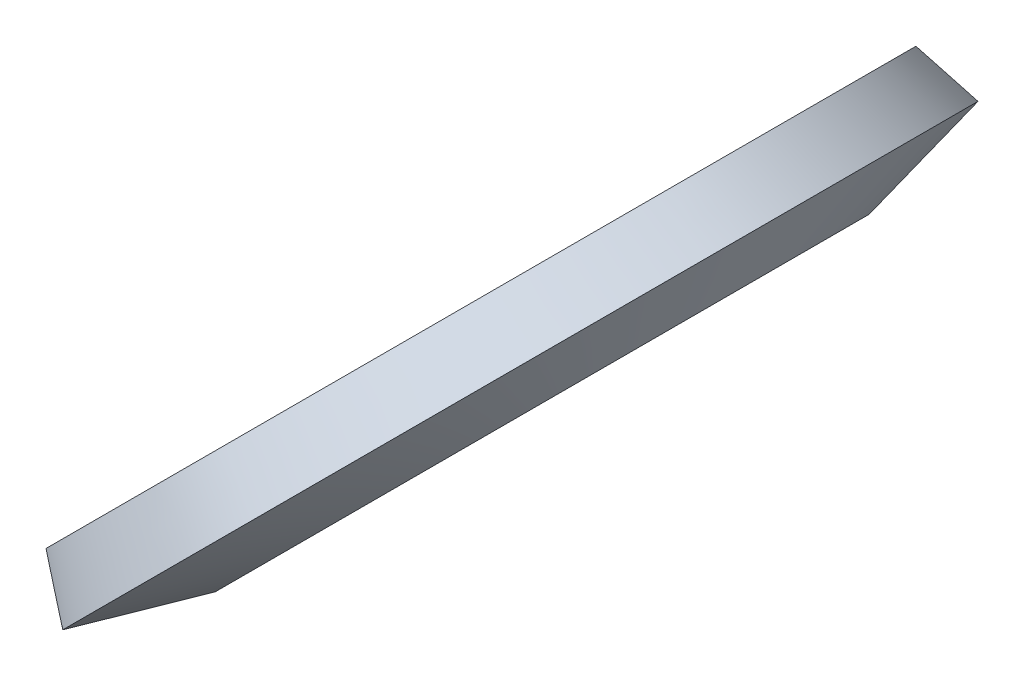
ISO-10303-21;
HEADER;
FILE_DESCRIPTION(('STEP AP214'),'2;1');
FILE_NAME('part.step','',(''),(''),'','','');
FILE_SCHEMA(('AUTOMOTIVE_DESIGN { 1 0 10303 214 1 1 1 1 }'));
ENDSEC;
DATA;
#1=APPLICATION_CONTEXT('core data for automotive mechanical design processes');
#2=APPLICATION_PROTOCOL_DEFINITION('international standard','automotive_design',2000,#1);
#3=PRODUCT_CONTEXT('',#1,'mechanical');
#4=PRODUCT('Part','Part','',(#3));
#5=PRODUCT_RELATED_PRODUCT_CATEGORY('part','',(#4));
#6=PRODUCT_DEFINITION_FORMATION('','',#4);
#7=PRODUCT_DEFINITION_CONTEXT('part definition',#1,'design');
#8=PRODUCT_DEFINITION('design','',#6,#7);
#9=PRODUCT_DEFINITION_SHAPE('','',#8);
#10=(LENGTH_UNIT() NAMED_UNIT(*) SI_UNIT(.MILLI.,.METRE.));
#11=(NAMED_UNIT(*) PLANE_ANGLE_UNIT() SI_UNIT($,.RADIAN.));
#12=(NAMED_UNIT(*) SI_UNIT($,.STERADIAN.) SOLID_ANGLE_UNIT());
#13=UNCERTAINTY_MEASURE_WITH_UNIT(LENGTH_MEASURE(1.E-05),#10,'distance_accuracy_value','');
#14=(GEOMETRIC_REPRESENTATION_CONTEXT(3) GLOBAL_UNCERTAINTY_ASSIGNED_CONTEXT((#13)) GLOBAL_UNIT_ASSIGNED_CONTEXT((#10,
#11,#12)) REPRESENTATION_CONTEXT('',''));
#15=CARTESIAN_POINT('',(0.,0.,0.));
#16=DIRECTION('',(0.,0.,1.));
#17=DIRECTION('',(1.,0.,0.));
#18=AXIS2_PLACEMENT_3D('',#15,#16,#17);
#19=CARTESIAN_POINT('',(9.30354534144064,-9.30354534144276,-47.6815));
#20=DIRECTION('',(-0.707106781186549,0.707106781186547,0.));
#21=DIRECTION('',(-0.707106781186547,-0.707106781186549,0.));
#22=AXIS2_PLACEMENT_3D('',#19,#20,#21);
#23=CONICAL_SURFACE('',#22,32.4888322096395,1.25115860945585);
#24=CARTESIAN_POINT('',(9.27532734281967,-9.27532734282178,-47.6815));
#25=DIRECTION('',(0.707106781186549,-0.707106781186547,0.));
#26=DIRECTION('',(0.707106781186547,0.707106781186549,0.));
#27=AXIS2_PLACEMENT_3D('',#24,#25,#26);
#28=CIRCLE('',#27,32.6093995729998);
#29=CARTESIAN_POINT('',(32.3336549113095,13.7830002256681,-47.6815));
#30=VERTEX_POINT('',#29);
#31=EDGE_CURVE('E53',#30,#30,#28,.F.);
#32=ORIENTED_EDGE('',*,*,#31,.T.);
#33=EDGE_LOOP('',(#32));
#34=FACE_BOUND('',#33,.T.);
#35=CARTESIAN_POINT('',(9.30354534144064,-9.30354534144276,-47.6815));
#36=DIRECTION('',(-0.707106781186549,0.707106781186547,0.));
#37=DIRECTION('',(-0.707106781186547,-0.707106781186549,0.));
#38=AXIS2_PLACEMENT_3D('',#35,#36,#37);
#39=CIRCLE('',#38,32.4888322096395);
#40=CARTESIAN_POINT('',(-13.6695282268274,-32.2766189097108,-47.6815));
#41=VERTEX_POINT('',#40);
#42=EDGE_CURVE('E56',#41,#41,#39,.T.);
#43=ORIENTED_EDGE('',*,*,#42,.F.);
#44=EDGE_LOOP('',(#43));
#45=FACE_BOUND('',#44,.T.);
#46=ADVANCED_FACE('F15',(#34,#45),#23,.F.);
#47=CARTESIAN_POINT('',(11.9527210513018,-11.9527210513039,-47.6815));
#48=DIRECTION('',(-0.707106781186549,0.707106781186547,0.));
#49=DIRECTION('',(-0.707106781186547,-0.707106781186549,0.));
#50=AXIS2_PLACEMENT_3D('',#47,#48,#49);
#51=CONICAL_SURFACE('',#50,23.2760744987763,1.25031206300701);
#52=CARTESIAN_POINT('',(11.9810112112742,-11.9810112112763,-47.6815));
#53=DIRECTION('',(0.707106781186549,-0.707106781186547,0.));
#54=DIRECTION('',(0.707106781186547,0.707106781186549,0.));
#55=AXIS2_PLACEMENT_3D('',#52,#53,#54);
#56=CIRCLE('',#55,23.1555409611302);
#57=CARTESIAN_POINT('',(28.3544512469323,4.39242882438176,-47.6815));
#58=VERTEX_POINT('',#57);
#59=EDGE_CURVE('E48',#58,#58,#56,.F.);
#60=ORIENTED_EDGE('',*,*,#59,.F.);
#61=EDGE_LOOP('',(#60));
#62=FACE_BOUND('',#61,.T.);
#63=CARTESIAN_POINT('',(11.9527210513018,-11.9527210513039,-47.6815));
#64=DIRECTION('',(-0.707106781186549,0.707106781186547,0.));
#65=DIRECTION('',(-0.707106781186547,-0.707106781186549,0.));
#66=AXIS2_PLACEMENT_3D('',#63,#64,#65);
#67=CIRCLE('',#66,23.2760744987763);
#68=CARTESIAN_POINT('',(-4.50594906618614,-28.411391168792,-47.6815));
#69=VERTEX_POINT('',#68);
#70=EDGE_CURVE('E34',#69,#69,#67,.T.);
#71=ORIENTED_EDGE('',*,*,#70,.T.);
#72=EDGE_LOOP('',(#71));
#73=FACE_BOUND('',#72,.T.);
#74=ADVANCED_FACE('F90',(#62,#73),#51,.F.);
#75=CARTESIAN_POINT('',(14.8013462689788,-14.8013462689809,-47.6815));
#76=DIRECTION('',(0.707106781186549,-0.707106781186547,0.));
#77=DIRECTION('',(0.707106781186547,0.707106781186549,0.));
#78=AXIS2_PLACEMENT_3D('',#75,#76,#77);
#79=CONICAL_SURFACE('',#78,24.4794501654306,0.320484263787889);
#80=ORIENTED_EDGE('',*,*,#59,.T.);
#81=EDGE_LOOP('',(#80));
#82=FACE_BOUND('',#81,.T.);
#83=CARTESIAN_POINT('',(32.2147574652405,2.44847205476165,-48.2773739556537));
#84=CARTESIAN_POINT('',(32.2029230886262,2.43663767814738,-48.9660076552401));
#85=CARTESIAN_POINT('',(32.1705536763777,2.40426826589886,-49.6538542120863));
#86=CARTESIAN_POINT('',(32.0649725007725,2.29868709029367,-51.0234760850385));
#87=CARTESIAN_POINT('',(31.9917499935742,2.22546458309536,-51.7052497561148));
#88=CARTESIAN_POINT('',(31.8048682745184,2.03858286403957,-53.0583947152509));
#89=CARTESIAN_POINT('',(31.6911643489558,1.92487893847699,-53.7297536405614));
#90=CARTESIAN_POINT('',(31.4241529971192,1.65786758664036,-55.0564860026139));
#91=CARTESIAN_POINT('',(31.2708482014105,1.50456279093171,-55.7118604979895));
#92=CARTESIAN_POINT('',(30.9258006679341,1.15951525745529,-57.0017094217907));
#93=CARTESIAN_POINT('',(30.7340753657144,0.967789955235613,-57.6361931790892));
#94=CARTESIAN_POINT('',(30.3135035684411,0.547218157962218,-58.8800707668851));
#95=CARTESIAN_POINT('',(30.0846564872383,0.318371076759427,-59.4894642010182));
#96=CARTESIAN_POINT('',(29.5915336216095,-0.174751788869351,-60.678664835056));
#97=CARTESIAN_POINT('',(29.327266881617,-0.439018528861878,-61.2584795358986));
#98=CARTESIAN_POINT('',(28.7651393020093,-1.0011461084695,-62.3845662293931));
#99=CARTESIAN_POINT('',(28.4672785938264,-1.29900681665237,-62.9308383532631));
#100=CARTESIAN_POINT('',(27.8400459562199,-1.92623945425895,-63.9860157280706));
#101=CARTESIAN_POINT('',(27.5106706812425,-2.25561472923638,-64.494917001599));
#102=CARTESIAN_POINT('',(26.8227768035597,-2.94350860691911,-65.471671249112));
#103=CARTESIAN_POINT('',(26.4642581713208,-3.30202723915809,-65.9395241814974));
#104=CARTESIAN_POINT('',(25.7206121235614,-4.0456732869175,-66.830872522353));
#105=CARTESIAN_POINT('',(25.3354836729142,-4.43080173756466,-67.2543662036262));
#106=CARTESIAN_POINT('',(24.5413686251991,-5.22491678527978,-68.0539642307673));
#107=CARTESIAN_POINT('',(24.1323820328021,-5.63390337767671,-68.4300685859132));
#108=CARTESIAN_POINT('',(23.2934661909901,-6.47281921948876,-69.1322075581434));
#109=CARTESIAN_POINT('',(22.8635373305969,-6.902748079882,-69.458243104835));
#110=CARTESIAN_POINT('',(21.9857864681109,-7.78049894236801,-70.0579349297685));
#111=CARTESIAN_POINT('',(21.5379644656882,-8.22832094479061,-70.3315912070448));
#112=CARTESIAN_POINT('',(20.6276120033529,-9.13867340712594,-70.8245784483427));
#113=CARTESIAN_POINT('',(20.1650815731977,-9.60120383728113,-71.0439095222652));
#114=CARTESIAN_POINT('',(19.2285997007983,-10.5376857096805,-71.4266877670392));
#115=CARTESIAN_POINT('',(18.7546482585672,-11.0116371519116,-71.5901349379551));
#116=CARTESIAN_POINT('',(17.7986929516727,-11.9675924588062,-71.859983625532));
#117=CARTESIAN_POINT('',(17.316689071627,-12.4495963388519,-71.9663850332079));
#118=CARTESIAN_POINT('',(16.348056537364,-13.4182288731149,-72.1213852664897));
#119=CARTESIAN_POINT('',(15.8614278831481,-13.9048575273308,-72.1699840921121));
#120=CARTESIAN_POINT('',(14.8870063247778,-14.8792790857011,-72.2090336171678));
#121=CARTESIAN_POINT('',(14.3992134227257,-15.3670719877532,-72.1994844215214));
#122=CARTESIAN_POINT('',(13.4259304024025,-16.3403550080763,-72.1223060382965));
#123=CARTESIAN_POINT('',(12.9404402841287,-16.8258451263502,-72.0546768507886));
#124=CARTESIAN_POINT('',(11.975214188025,-17.7910712224538,-71.8618192498777));
#125=CARTESIAN_POINT('',(11.4954782123459,-18.270807198133,-71.7365908149467));
#126=CARTESIAN_POINT('',(10.5451712175525,-19.2211141929264,-71.4294250102947));
#127=CARTESIAN_POINT('',(10.0746001984504,-19.6916852120285,-71.2474876404986));
#128=CARTESIAN_POINT('',(9.14596810070746,-20.6203173097714,-70.828197208621));
#129=CARTESIAN_POINT('',(8.68790703528488,-21.078378375194,-70.590844087989));
#130=CARTESIAN_POINT('',(7.78755190548236,-21.9787335049965,-70.0624096991254));
#131=CARTESIAN_POINT('',(7.34525784111051,-22.4210275693684,-69.7713284308664));
#132=CARTESIAN_POINT('',(6.47958130385099,-23.2867041066279,-69.1375072658387));
#133=CARTESIAN_POINT('',(6.05619882480022,-23.7100865856787,-68.7947673859053));
#134=CARTESIAN_POINT('',(5.23135530188844,-24.5349301085905,-68.0600656042169));
#135=CARTESIAN_POINT('',(4.82989425801139,-24.9363911524675,-67.668103702498));
#136=CARTESIAN_POINT('',(4.051747911582,-25.7145374988969,-66.8377446608894));
#137=CARTESIAN_POINT('',(3.67506259899396,-26.091222811485,-66.3993475398089));
#138=CARTESIAN_POINT('',(2.94914554309775,-26.8171398673812,-65.4792346684112));
#139=CARTESIAN_POINT('',(2.59991379978639,-27.1663716106925,-64.997518918099));
#140=CARTESIAN_POINT('',(1.93138666398153,-27.8348987464974,-63.9941934282846));
#141=CARTESIAN_POINT('',(1.61209127559586,-28.154194134883,-63.4725836833082));
#142=CARTESIAN_POINT('',(1.00570690231933,-28.7605785081596,-62.3931785942949));
#143=CARTESIAN_POINT('',(0.718617917436547,-29.0476674930424,-61.835383250249));
#144=CARTESIAN_POINT('',(0.178687346310818,-29.5875980641681,-60.6875724782232));
#145=CARTESIAN_POINT('',(-0.0741542354534744,-29.8404396459324,-60.0975570460298));
#146=CARTESIAN_POINT('',(-0.543792403641475,-30.3100778141204,-58.8895008211666));
#147=CARTESIAN_POINT('',(-0.760588990063917,-30.5268744005428,-58.2714600284957));
#148=CARTESIAN_POINT('',(-1.15659586503571,-30.9228812755146,-57.0117470100303));
#149=CARTESIAN_POINT('',(-1.33580615519643,-31.1020915656754,-56.3700747852489));
#150=CARTESIAN_POINT('',(-1.6553663715058,-31.4216517819847,-55.0676607828712));
#151=CARTESIAN_POINT('',(-1.79571629765749,-31.5620017081364,-54.4069190052764));
#152=CARTESIAN_POINT('',(-2.03655797660175,-31.8028433870807,-53.0710634057529));
#153=CARTESIAN_POINT('',(-2.13704973119108,-31.90333514167,-52.3959495844719));
#154=CARTESIAN_POINT('',(-2.29746063990684,-32.0637460503858,-51.0361495233053));
#155=CARTESIAN_POINT('',(-2.35737979403435,-32.1236652045133,-50.3514632834197));
#156=CARTESIAN_POINT('',(-2.43621951256109,-32.20250492304,-48.9773860937555));
#157=CARTESIAN_POINT('',(-2.45514007696031,-32.2214254874392,-48.2879951439767));
#158=CARTESIAN_POINT('',(-2.45184810216198,-32.2181335126409,-46.9094096909043));
#159=CARTESIAN_POINT('',(-2.42963556296333,-32.1959209734422,-46.2202151876107));
#160=CARTESIAN_POINT('',(-2.3442352968744,-32.1105207073533,-44.846922356305));
#161=CARTESIAN_POINT('',(-2.28104756813701,-32.0473329786159,-44.1628240285226));
#162=CARTESIAN_POINT('',(-2.11414614810939,-31.8804315585883,-42.8045871091045));
#163=CARTESIAN_POINT('',(-2.010432456816,-31.7767178672949,-42.1304485174696));
#164=CARTESIAN_POINT('',(-1.76321644861025,-31.5295018590892,-40.7969237634756));
#165=CARTESIAN_POINT('',(-1.61971412999211,-31.385999540471,-40.1375376017491));
#166=CARTESIAN_POINT('',(-1.29394108466351,-31.0602264951424,-38.8382055786143));
#167=CARTESIAN_POINT('',(-1.1116703579544,-30.8779557684333,-38.1982597172054));
#168=CARTESIAN_POINT('',(-0.709656358600851,-30.4759417690798,-36.9423580091493));
#169=CARTESIAN_POINT('',(-0.489913090856829,-30.2561985013358,-36.3264021593648));
#170=CARTESIAN_POINT('',(-0.0145162357424346,-29.7808016462213,-35.1228594626605));
#171=CARTESIAN_POINT('',(0.241137351618932,-29.52514805886,-34.5352726157335));
#172=CARTESIAN_POINT('',(0.786537264947313,-28.9797481455316,-33.3926453929662));
#173=CARTESIAN_POINT('',(1.07628358623616,-28.6900018242428,-32.8376050126599));
#174=CARTESIAN_POINT('',(1.68780907359707,-28.0784763368819,-31.7640166386498));
#175=CARTESIAN_POINT('',(2.00958823967287,-27.7566971708061,-31.2454686449502));
#176=CARTESIAN_POINT('',(2.68289189698623,-27.0833935134927,-30.248551406158));
#177=CARTESIAN_POINT('',(3.03441640027253,-26.7318690102064,-29.7701821773406));
#178=CARTESIAN_POINT('',(3.76471149019782,-26.0015739202811,-28.8570236227308));
#179=CARTESIAN_POINT('',(4.14348207685675,-25.6228033336221,-28.4222342969703));
#180=CARTESIAN_POINT('',(4.92557662788529,-24.8407087825936,-27.599326507444));
#181=CARTESIAN_POINT('',(5.32890060025662,-24.4373848102223,-27.2112080588878));
#182=CARTESIAN_POINT('',(6.15723441623828,-23.6090509942406,-26.4844014811386));
#183=CARTESIAN_POINT('',(6.58224425983748,-23.1840411506414,-26.1457133519202));
#184=CARTESIAN_POINT('',(7.45092779041829,-22.3153576200606,-25.5201756155875));
#185=CARTESIAN_POINT('',(7.89460145767971,-21.8716839527992,-25.2333259537025));
#186=CARTESIAN_POINT('',(8.79745880443724,-20.9688266060417,-24.7135040389413));
#187=CARTESIAN_POINT('',(9.25664248391283,-20.5096429265661,-24.4805317859939));
#188=CARTESIAN_POINT('',(10.1872551640514,-19.5790302464275,-24.0701210568959));
#189=CARTESIAN_POINT('',(10.6586841601375,-19.1076012503414,-23.8926825599893));
#190=CARTESIAN_POINT('',(11.6104360671496,-18.1558493433293,-23.5946007035583));
#191=CARTESIAN_POINT('',(12.0907589780864,-17.6755264323925,-23.4739573441028));
#192=CARTESIAN_POINT('',(13.056884784911,-16.7094006255679,-23.2903232976524));
#193=CARTESIAN_POINT('',(13.5426876906852,-16.2235977197937,-23.2273327146844));
#194=CARTESIAN_POINT('',(14.5163188608342,-15.2499665496446,-23.159452421439));
#195=CARTESIAN_POINT('',(15.0041471252097,-14.7621382852691,-23.1545627111782));
#196=CARTESIAN_POINT('',(15.9783599080995,-13.7879255023794,-23.2029188799176));
#197=CARTESIAN_POINT('',(16.4647444293701,-13.3015409811088,-23.2561646478514));
#198=CARTESIAN_POINT('',(17.4326127677963,-12.3336726426826,-23.4204130520501));
#199=CARTESIAN_POINT('',(17.9140965849463,-11.8521888255326,-23.5314156883817));
#200=CARTESIAN_POINT('',(18.8687414271957,-10.8975439832832,-23.8103889519313));
#201=CARTESIAN_POINT('',(19.3419024354559,-10.424382975023,-23.9783596943974));
#202=CARTESIAN_POINT('',(20.2765367502882,-9.48974866019072,-24.370074939388));
#203=CARTESIAN_POINT('',(20.7380100570756,-9.02827535340326,-24.5938194408843));
#204=CARTESIAN_POINT('',(21.6459966121558,-8.12028879832307,-25.0954961766395));
#205=CARTESIAN_POINT('',(22.0925095824933,-7.67377582798556,-25.3734294170432));
#206=CARTESIAN_POINT('',(22.9673919949796,-6.79889341549932,-25.9815050304892));
#207=CARTESIAN_POINT('',(23.3957614335761,-6.3705239769028,-26.311647413753));
#208=CARTESIAN_POINT('',(24.2312948397116,-5.53499057076731,-27.0217802238003));
#209=CARTESIAN_POINT('',(24.6384596319311,-5.12782577854779,-27.4017687099684));
#210=CARTESIAN_POINT('',(25.4287066992065,-4.3375787112724,-28.2089018955497));
#211=CARTESIAN_POINT('',(25.8117889986672,-3.95449641181161,-28.6360465471741));
#212=CARTESIAN_POINT('',(26.5511088247241,-3.21517658575475,-29.5344079695772));
#213=CARTESIAN_POINT('',(26.907349199673,-2.85893621080589,-30.0056200521774));
#214=CARTESIAN_POINT('',(27.590499509162,-2.17578590131682,-30.9888074107547));
#215=CARTESIAN_POINT('',(27.9174093289486,-1.84887608153023,-31.5007828462006));
#216=CARTESIAN_POINT('',(28.5396527900849,-1.22663262039397,-32.5619918827971));
#217=CARTESIAN_POINT('',(28.834978360446,-0.931307050032827,-33.1112349489311));
#218=CARTESIAN_POINT('',(29.3918531762157,-0.374432234263136,-34.2429476359093));
#219=CARTESIAN_POINT('',(29.6534029549188,-0.112882455560033,-34.8254167319297));
#220=CARTESIAN_POINT('',(30.1409823645498,0.374696954070969,-36.0197192419979));
#221=CARTESIAN_POINT('',(30.366995851537,0.600710441058109,-36.6315658382646));
#222=CARTESIAN_POINT('',(30.7817647565483,1.01547934606942,-37.8800618916857));
#223=CARTESIAN_POINT('',(30.9705176991071,1.20423228862829,-38.5167129934059));
#224=CARTESIAN_POINT('',(31.3092163344746,1.54293092399579,-39.8095460464604));
#225=CARTESIAN_POINT('',(31.4592047466562,1.69291933617731,-40.4657056018401));
#226=CARTESIAN_POINT('',(31.7195448283167,1.95325941783782,-41.7933369241264));
#227=CARTESIAN_POINT('',(31.8299069135479,2.06362150306905,-42.4648046178769));
#228=CARTESIAN_POINT('',(32.0327208400385,2.26643542955973,-43.9871142712427));
#229=CARTESIAN_POINT('',(32.1138810531157,2.3475956426369,-44.8410112567757));
#230=CARTESIAN_POINT('',(32.2122890744332,2.44600366395438,-46.5561393660481));
#231=CARTESIAN_POINT('',(32.2295368826735,2.46325147219468,-47.4173704897876));
#232=CARTESIAN_POINT('',(32.2147574652405,2.44847205476165,-48.2773739556537));
#233=B_SPLINE_CURVE_WITH_KNOTS('',3,(#83,#84,#85,#86,#87,#88,#89,#90,#91,#92,#93,#94,#95,#96,
#97,#98,#99,#100,#101,#102,#103,#104,#105,#106,#107,#108,#109,#110,#111,#112,#113,#114,#115,
#116,#117,#118,#119,#120,#121,#122,#123,#124,#125,#126,#127,#128,#129,#130,#131,#132,#133,#134,
#135,#136,#137,#138,#139,#140,#141,#142,#143,#144,#145,#146,#147,#148,#149,#150,#151,#152,#153,
#154,#155,#156,#157,#158,#159,#160,#161,#162,#163,#164,#165,#166,#167,#168,#169,#170,#171,#172,
#173,#174,#175,#176,#177,#178,#179,#180,#181,#182,#183,#184,#185,#186,#187,#188,#189,#190,#191,
#192,#193,#194,#195,#196,#197,#198,#199,#200,#201,#202,#203,#204,#205,#206,#207,#208,#209,#210,
#211,#212,#213,#214,#215,#216,#217,#218,#219,#220,#221,#222,#223,#224,#225,#226,#227,#228,#229,
#230,#231,#232),.UNSPECIFIED.,.T.,.F.,(4,2,2,2,2,2,2,2,2,2,2,2,2,2,2,2,2,2,2,2,2,2,2,2,2,2,2,2,
2,2,2,2,2,2,2,2,2,2,2,2,2,2,2,2,2,2,2,2,2,2,2,2,2,2,2,2,2,2,2,2,2,2,2,2,2,2,2,2,2,2,2,2,2,2,4),
(0.,2.06575970447976,4.13206293359958,6.20065561279211,8.26911091698306,10.3366296559171,
12.404181043938,14.4712054836141,16.5382218365949,18.6054578658699,20.6726959900941,
22.7400145755785,24.8073327563181,26.8746125493549,28.9418923804979,31.0091680294628,
33.0764436760443,35.1437232721089,37.2110028675821,39.2782787329303,41.3455545957704,
43.4128312312695,45.4801078695046,47.5473866919706,49.6146655154965,51.6819436653124,
53.7492218136166,55.8164991245398,57.8837764352227,59.9510540295749,62.0183316244454,
64.0856094896609,66.1528873549489,68.2201651316106,70.2874429081108,72.3547205914206,
74.421998274675,76.4892759579293,78.5565536412391,80.6238314177394,82.691109194401,
84.758387059689,86.8256649249044,88.892942519775,90.9602201141271,93.0274974248099,
95.0947747357332,97.1620528840373,99.2293310338532,101.296609857379,103.363888679845,
105.43116531808,107.498441953579,109.565717816419,111.632993681767,113.700273277241,
115.767552873305,117.834828519887,119.902104168852,121.969383999995,124.036663793031,
126.103981973771,128.171300559255,130.238538683479,132.305774712754,134.372791065735,
136.439815505411,138.507366893432,140.574885632366,142.643340936557,144.71193361575,
146.778236844869,148.843996549349,151.42383036603,154.003664182711),.UNSPECIFIED.);
#234=CARTESIAN_POINT('',(32.2147574652405,2.44847205476165,-48.2773739556537));
#235=VERTEX_POINT('',#234);
#236=EDGE_CURVE('E59',#235,#235,#233,.T.);
#237=ORIENTED_EDGE('',*,*,#236,.F.);
#238=EDGE_LOOP('',(#237));
#239=FACE_BOUND('',#238,.T.);
#240=ADVANCED_FACE('F86',(#82,#239),#79,.F.);
#241=CARTESIAN_POINT('',(9.27532734281967,-9.27532734282178,-47.6815));
#242=DIRECTION('',(0.707106781186549,-0.707106781186547,0.));
#243=DIRECTION('',(0.707106781186547,0.707106781186549,0.));
#244=AXIS2_PLACEMENT_3D('',#241,#242,#243);
#245=CONICAL_SURFACE('',#244,32.6093995729998,0.319637717339043);
#246=CARTESIAN_POINT('',(37.1409642380814,11.3558699832728,-48.5151793219077));
#247=CARTESIAN_POINT('',(37.1265445973949,11.3414503425863,-49.3539315689927));
#248=CARTESIAN_POINT('',(37.0903561434953,11.3052618886868,-50.1919779253497));
#249=CARTESIAN_POINT('',(36.9746286136576,11.1895343588491,-51.8620825289094));
#250=CARTESIAN_POINT('',(36.8950875793754,11.1099933245669,-52.6941405038815));
#251=CARTESIAN_POINT('',(36.6930207678407,10.9079265130322,-54.3483128894096));
#252=CARTESIAN_POINT('',(36.5704662490176,10.7853719942091,-55.1704202700695));
#253=CARTESIAN_POINT('',(36.2830162262268,10.4979219714183,-56.7997951643614));
#254=CARTESIAN_POINT('',(36.1181192444134,10.3330249896048,-57.6070621589769));
#255=CARTESIAN_POINT('',(35.8259559031771,10.0408616483686,-58.8625831675134));
#256=CARTESIAN_POINT('',(35.7125516592331,9.92745740442454,-59.3173796496774));
#257=CARTESIAN_POINT('',(35.47231744619,9.68722319138146,-60.219714559994));
#258=CARTESIAN_POINT('',(35.3454900900567,9.56039583524819,-60.6672543812514));
#259=CARTESIAN_POINT('',(34.9451146043048,9.16002034949625,-61.9980714800357));
#260=CARTESIAN_POINT('',(34.6516675559885,8.86657330117995,-62.8695700242447));
#261=CARTESIAN_POINT('',(34.0138708931696,8.22877663836104,-64.5745919781373));
#262=CARTESIAN_POINT('',(33.6695095986614,7.88441534385288,-65.408106616555));
#263=CARTESIAN_POINT('',(32.9323523911917,7.1472581363832,-67.0311511121955));
#264=CARTESIAN_POINT('',(32.5395576819772,6.75446342716866,-67.8206820618656));
#265=CARTESIAN_POINT('',(31.7083700598794,5.92327580507091,-69.3500543529127));
#266=CARTESIAN_POINT('',(31.2699814488692,5.48488719406068,-70.0899003713387));
#267=CARTESIAN_POINT('',(30.3506866508756,4.56559239606705,-71.5147392864663));
#268=CARTESIAN_POINT('',(29.8697802127903,4.08468595798181,-72.1997318591689));
#269=CARTESIAN_POINT('',(28.8689028698958,3.08380861508729,-73.5099453952777));
#270=CARTESIAN_POINT('',(28.3489343781491,2.56384012334052,-74.1351700454401));
#271=CARTESIAN_POINT('',(27.2736038341572,1.48850957934862,-75.3214508354055));
#272=CARTESIAN_POINT('',(26.7182418319873,0.933147577178778,-75.8825070659919));
#273=CARTESIAN_POINT('',(25.5760575268579,-0.209036727950622,-76.9364763764581));
#274=CARTESIAN_POINT('',(24.9892344433341,-0.795859811474417,-77.4293877645455));
#275=CARTESIAN_POINT('',(23.7883122994825,-1.99678195532611,-78.3435468572344));
#276=CARTESIAN_POINT('',(23.1742132298068,-2.61088102500173,-78.7647945372759));
#277=CARTESIAN_POINT('',(21.9230983847235,-3.86199587008505,-79.5326353492035));
#278=CARTESIAN_POINT('',(21.2860823625521,-4.49901189225651,-79.8792276769392));
#279=CARTESIAN_POINT('',(19.9936687573321,-5.79142549747647,-80.4952879268485));
#280=CARTESIAN_POINT('',(19.3382711754615,-6.44682307934706,-80.7647558539642));
#281=CARTESIAN_POINT('',(18.0137571290566,-7.77133712575195,-81.2246504517471));
#282=CARTESIAN_POINT('',(17.3446407304238,-8.44045352438477,-81.4150775020118));
#283=CARTESIAN_POINT('',(15.9974430167252,-9.78765123808334,-81.7155383883217));
#284=CARTESIAN_POINT('',(15.3193617016077,-10.4657325532009,-81.825572223902));
#285=CARTESIAN_POINT('',(13.9590557683274,-11.8260384864812,-81.9644643162246));
#286=CARTESIAN_POINT('',(13.2768311553418,-12.5082630994668,-81.9933226743756));
#287=CARTESIAN_POINT('',(11.9130879884234,-13.8720062663852,-81.9696589364741));
#288=CARTESIAN_POINT('',(11.2315694344902,-14.5535248203184,-81.9171368404699));
#289=CARTESIAN_POINT('',(9.8740830925023,-15.9110111623063,-81.7310855291356));
#290=CARTESIAN_POINT('',(9.19811530833315,-16.5869789464754,-81.5975562571059));
#291=CARTESIAN_POINT('',(7.85653671571245,-17.9285575390961,-81.2504398586621));
#292=CARTESIAN_POINT('',(7.19092590726362,-18.594168347545,-81.0368527322269));
#293=CARTESIAN_POINT('',(5.87479346167718,-19.9103007931314,-80.5311391404419));
#294=CARTESIAN_POINT('',(5.22427182223177,-20.5608224325768,-80.2390126871044));
#295=CARTESIAN_POINT('',(3.94294242776534,-21.8421518270433,-79.5782972706172));
#296=CARTESIAN_POINT('',(3.31213467274195,-22.4729595820666,-79.2097083074767));
#297=CARTESIAN_POINT('',(2.07471771581806,-23.7103765389905,-78.3986883204402));
#298=CARTESIAN_POINT('',(1.46810851375141,-24.3169857410572,-77.9562572970512));
#299=CARTESIAN_POINT('',(0.283401285376274,-25.5016929694324,-77.0006986066982));
#300=CARTESIAN_POINT('',(-0.294696740929125,-26.0797909957378,-76.4875709397266));
#301=CARTESIAN_POINT('',(-1.41827178143872,-27.2033660362474,-75.3942669007641));
#302=CARTESIAN_POINT('',(-1.9637487902114,-27.74884304502,-74.8140905176095));
#303=CARTESIAN_POINT('',(-3.01820367583335,-28.803297930642,-73.5908138221522));
#304=CARTESIAN_POINT('',(-3.5271815526784,-29.312275807487,-72.9477135098422));
#305=CARTESIAN_POINT('',(-4.50501962294772,-30.2901138777563,-71.603161046558));
#306=CARTESIAN_POINT('',(-4.9738798182654,-30.758974073074,-70.9017088983378));
#307=CARTESIAN_POINT('',(-5.86814923700071,-31.6532434918094,-69.4454396419202));
#308=CARTESIAN_POINT('',(-6.29355846042389,-32.0786527152325,-68.6906225337297));
#309=CARTESIAN_POINT('',(-7.09790150147295,-32.8829957562816,-67.1329897113406));
#310=CARTESIAN_POINT('',(-7.47683532245141,-33.26192957726,-66.3301740006045));
#311=CARTESIAN_POINT('',(-8.18553360212502,-33.9706278569337,-64.6822514621138));
#312=CARTESIAN_POINT('',(-8.51529806082115,-34.3003923156298,-63.83714463436));
#313=CARTESIAN_POINT('',(-9.12331319634807,-34.9084074511567,-62.1106480419508));
#314=CARTESIAN_POINT('',(-9.40156387182861,-35.1866581266373,-61.2292582763444));
#315=CARTESIAN_POINT('',(-9.90457323470468,-35.6896674895133,-59.4364619819751));
#316=CARTESIAN_POINT('',(-10.1293319220978,-35.9144261769064,-58.5250554532108));
#317=CARTESIAN_POINT('',(-10.5237594131083,-36.3088536679169,-56.6787051685401));
#318=CARTESIAN_POINT('',(-10.6934282156381,-36.4785224704467,-55.743761412169));
#319=CARTESIAN_POINT('',(-10.9764696872916,-36.7615639421002,-53.8569835796799));
#320=CARTESIAN_POINT('',(-11.0898423564155,-36.8749366112241,-52.9051495035619));
#321=CARTESIAN_POINT('',(-11.2594855480596,-37.0445798028682,-50.991358017888));
#322=CARTESIAN_POINT('',(-11.3157560715446,-37.1008503263533,-50.0294006085031));
#323=CARTESIAN_POINT('',(-11.3707949255749,-37.1558891803835,-48.1022013812012));
#324=CARTESIAN_POINT('',(-11.3695632561207,-37.1546575109293,-47.1369595632842));
#325=CARTESIAN_POINT('',(-11.3096064802821,-37.0947007350907,-45.2100537962817));
#326=CARTESIAN_POINT('',(-11.2508813730907,-37.0359756278994,-44.2483898472464));
#327=CARTESIAN_POINT('',(-11.0763552209152,-36.8614494757239,-42.3354766862125));
#328=CARTESIAN_POINT('',(-10.9605541759285,-36.7456484307372,-41.3842274742143));
#329=CARTESIAN_POINT('',(-10.6726994198593,-36.457793674668,-39.4989065707911));
#330=CARTESIAN_POINT('',(-10.500645707074,-36.2857399618827,-38.5648348798861));
#331=CARTESIAN_POINT('',(-10.1015088152604,-35.8866030700691,-36.7205097388255));
#332=CARTESIAN_POINT('',(-9.87442563623283,-35.6595198910415,-35.8102562886696));
#333=CARTESIAN_POINT('',(-9.3668442563502,-35.1519385111589,-34.0200390530325));
#334=CARTESIAN_POINT('',(-9.08634605947656,-34.8714403142852,-33.1400752652936));
#335=CARTESIAN_POINT('',(-8.47392880693943,-34.2590230617481,-31.416693298121));
#336=CARTESIAN_POINT('',(-8.14200975128356,-33.9271040060923,-30.5732751186818));
#337=CARTESIAN_POINT('',(-7.42911055601143,-33.2142048108201,-28.9289806333051));
#338=CARTESIAN_POINT('',(-7.04813042043893,-32.8332246752476,-28.1281043238611));
#339=CARTESIAN_POINT('',(-6.2398175838785,-32.0249118386872,-26.574587252961));
#340=CARTESIAN_POINT('',(-5.81248488288747,-31.5975791376961,-25.8219464915082));
#341=CARTESIAN_POINT('',(-4.91450488665982,-30.6995991414685,-24.3702511663641));
#342=CARTESIAN_POINT('',(-4.44385758105829,-30.2289518358669,-23.6711966154957));
#343=CARTESIAN_POINT('',(-3.46259448341542,-29.2476887382241,-22.3316437710457));
#344=CARTESIAN_POINT('',(-2.95197869135672,-28.7370729461654,-21.6911454774894));
#345=CARTESIAN_POINT('',(-1.89440869251084,-27.6795029473195,-20.4732585910979));
#346=CARTESIAN_POINT('',(-1.34745447874508,-27.1325487335537,-19.8958700103826));
#347=CARTESIAN_POINT('',(-0.221096243429823,-26.0061904982385,-18.8083075805606));
#348=CARTESIAN_POINT('',(0.358307778109554,-25.4267864766991,-18.2981337314328));
#349=CARTESIAN_POINT('',(1.54544604070328,-24.2396482141054,-17.3486280933868));
#350=CARTESIAN_POINT('',(2.15318026410127,-23.6319139907074,-16.909296260318));
#351=CARTESIAN_POINT('',(3.39265864151995,-22.3924356132887,-16.1045976542258));
#352=CARTESIAN_POINT('',(4.02440279552256,-21.7606914592861,-15.7392308811467));
#353=CARTESIAN_POINT('',(5.30740957764866,-20.47768467716,-15.0850600019094));
#354=CARTESIAN_POINT('',(5.95867220160174,-19.8264220532069,-14.7962558793925));
#355=CARTESIAN_POINT('',(7.27608597057161,-18.509008284237,-14.2972634205112));
#356=CARTESIAN_POINT('',(7.9422371155982,-17.8428571392104,-14.0870750841986));
#357=CARTESIAN_POINT('',(9.28469270183943,-16.5004015529692,-13.746808330728));
#358=CARTESIAN_POINT('',(9.96099715372164,-15.824097101087,-13.6167299977436));
#359=CARTESIAN_POINT('',(11.3189505447639,-14.4661437100447,-13.4376083783696));
#360=CARTESIAN_POINT('',(12.0005994839254,-13.7844947708832,-13.3885650920004));
#361=CARTESIAN_POINT('',(13.3643949311704,-12.4206993236382,-13.371862244258));
#362=CARTESIAN_POINT('',(14.0465414386716,-11.738552816137,-13.4042025877807));
#363=CARTESIAN_POINT('',(15.4064831724681,-10.3786110823405,-13.5500368793994));
#364=CARTESIAN_POINT('',(16.084278398761,-9.7008158560476,-13.663530827541));
#365=CARTESIAN_POINT('',(17.4306997282975,-8.35439452651108,-13.9708656546134));
#366=CARTESIAN_POINT('',(18.0993258197054,-7.68576843510325,-14.1647066372484));
#367=CARTESIAN_POINT('',(19.4226544390085,-6.36243981580012,-14.6313574433547));
#368=CARTESIAN_POINT('',(20.0773569670654,-5.7077372877432,-14.9041672659093));
#369=CARTESIAN_POINT('',(21.3681911217326,-4.41690313307598,-15.5268197107634));
#370=CARTESIAN_POINT('',(22.0043225412405,-3.78077171356812,-15.8766631917603));
#371=CARTESIAN_POINT('',(23.2534843232795,-2.53160993152909,-16.6508940145939));
#372=CARTESIAN_POINT('',(23.866514682937,-1.91857957187162,-17.0752813657036));
#373=CARTESIAN_POINT('',(25.0651018208193,-0.719992433989252,-17.9955718870394));
#374=CARTESIAN_POINT('',(25.6506592424052,-0.134435012403414,-18.491473381439));
#375=CARTESIAN_POINT('',(26.7901526226226,1.00505836781406,-19.5512738172796));
#376=CARTESIAN_POINT('',(27.3440886018356,1.55899434702705,-20.1151727144625));
#377=CARTESIAN_POINT('',(28.4163673119988,2.63127305719025,-21.3069213730551));
#378=CARTESIAN_POINT('',(28.9347123044684,3.14961804965983,-21.9347670648559));
#379=CARTESIAN_POINT('',(29.9321644095903,4.14707015478172,-23.2499778591457));
#380=CARTESIAN_POINT('',(30.4112714215792,4.62617716677062,-23.9373431143203));
#381=CARTESIAN_POINT('',(31.326910498792,5.54181624398344,-25.3668149714401));
#382=CARTESIAN_POINT('',(31.7634360410442,5.97834178623561,-26.1089299298993));
#383=CARTESIAN_POINT('',(32.5907207709499,6.80562651614134,-27.642523947009));
#384=CARTESIAN_POINT('',(32.9814804382098,7.19638618340127,-28.4340024882176));
#385=CARTESIAN_POINT('',(33.7145585310409,7.9294642762324,-30.0609198693284));
#386=CARTESIAN_POINT('',(34.0568639327558,8.27176967794727,-30.8963704458578));
#387=CARTESIAN_POINT('',(34.690488456979,8.90539420217043,-32.6051371890747));
#388=CARTESIAN_POINT('',(34.9818053252452,9.19671107043668,-33.4784550277741));
#389=CARTESIAN_POINT('',(35.511186047287,9.72609179247844,-35.2561050114627));
#390=CARTESIAN_POINT('',(35.7492845639273,9.96419030911875,-36.1604165238945));
#391=CARTESIAN_POINT('',(36.1707513450351,10.3856570902266,-37.9940884547783));
#392=CARTESIAN_POINT('',(36.3541292285863,10.5690349737777,-38.9234444394265));
#393=CARTESIAN_POINT('',(36.6266877749008,10.8415935200922,-40.5697918320127));
#394=CARTESIAN_POINT('',(36.7279427537992,10.9428484989906,-41.2828390968715));
#395=CARTESIAN_POINT('',(36.8982372163005,11.113142961492,-42.7167556487425));
#396=CARTESIAN_POINT('',(36.9672708460266,11.182176591218,-43.4376263327665));
#397=CARTESIAN_POINT('',(37.0727879281818,11.2876936733733,-44.8838722408727));
#398=CARTESIAN_POINT('',(37.109282050816,11.3241877960075,-45.609245909732));
#399=CARTESIAN_POINT('',(37.1496119168918,11.3645176620833,-47.0616495922097));
#400=CARTESIAN_POINT('',(37.1534540644729,11.3683598096643,-47.7886792530511));
#401=CARTESIAN_POINT('',(37.1409642380814,11.3558699832728,-48.5151793219077));
#402=B_SPLINE_CURVE_WITH_KNOTS('',3,(#246,#247,#248,#249,#250,#251,#252,#253,#254,#255,#256,
#257,#258,#259,#260,#261,#262,#263,#264,#265,#266,#267,#268,#269,#270,#271,#272,#273,#274,#275,
#276,#277,#278,#279,#280,#281,#282,#283,#284,#285,#286,#287,#288,#289,#290,#291,#292,#293,#294,
#295,#296,#297,#298,#299,#300,#301,#302,#303,#304,#305,#306,#307,#308,#309,#310,#311,#312,#313,
#314,#315,#316,#317,#318,#319,#320,#321,#322,#323,#324,#325,#326,#327,#328,#329,#330,#331,#332,
#333,#334,#335,#336,#337,#338,#339,#340,#341,#342,#343,#344,#345,#346,#347,#348,#349,#350,#351,
#352,#353,#354,#355,#356,#357,#358,#359,#360,#361,#362,#363,#364,#365,#366,#367,#368,#369,#370,
#371,#372,#373,#374,#375,#376,#377,#378,#379,#380,#381,#382,#383,#384,#385,#386,#387,#388,#389,
#390,#391,#392,#393,#394,#395,#396,#397,#398,#399,#400,#401),.UNSPECIFIED.,.T.,.F.,(4,2,2,2,2,2,
2,2,2,2,2,2,2,2,2,2,2,2,2,2,2,2,2,2,2,2,2,2,2,2,2,2,2,2,2,2,2,2,2,2,2,2,2,2,2,2,2,2,2,2,2,2,2,2,
2,2,2,2,2,2,2,2,2,2,2,2,2,2,2,2,2,2,2,2,2,2,2,4),(0.,2.51651185884528,5.03313740422601,
7.55144776807376,10.069846038489,11.5161925645093,12.9622580583068,15.8543146467784,
18.7470357211723,21.6396849153838,24.5320614297134,27.4244550269849,30.3166700930309,
33.2088810672169,36.1011638317562,38.993447587515,41.885762495958,44.7780772190588,
47.6703780515192,50.5626789007018,53.4549761366605,56.347273370901,59.2395726295557,
62.1318718889739,65.0241707060314,67.9164695227433,70.8087683195962,73.7010671167626,
76.5933663955064,79.4856656745855,82.3779648171584,85.2702639593612,88.1625628929229,
91.0548618264276,93.9471608357444,96.839459845193,99.7317589117394,102.62405797827,
105.516356995926,108.408656013548,111.300955071766,114.193254130112,117.085553276,
119.977852421849,122.870151352116,125.762450281954,128.6547489734,131.547047665039,
134.439347048789,137.331646433796,140.223946374255,143.116246313812,146.008544450813,
148.900842585638,151.793140102486,154.685437621238,157.577738178993,160.47003873748,
163.362335916058,166.25463309626,169.146934009577,172.039234889323,174.931568011298,
177.823901493069,180.716167208367,183.608431041163,186.500510923584,189.392598225283,
192.285127866695,195.177627192948,198.07090251389,200.964305716454,203.855818822619,
206.746823343416,208.927291549641,211.108155742665,213.288304533482,215.468025714657),.UNSPECIFIED.);
#403=CARTESIAN_POINT('',(37.1409642380814,11.3558699832728,-48.5151793219077));
#404=VERTEX_POINT('',#403);
#405=EDGE_CURVE('E62',#404,#404,#402,.T.);
#406=ORIENTED_EDGE('',*,*,#405,.T.);
#407=EDGE_LOOP('',(#406));
#408=FACE_BOUND('',#407,.T.);
#409=ORIENTED_EDGE('',*,*,#31,.F.);
#410=EDGE_LOOP('',(#409));
#411=FACE_BOUND('',#410,.T.);
#412=ADVANCED_FACE('F76',(#408,#411),#245,.T.);
#413=CARTESIAN_POINT('',(-11.4172444254898,-37.029782203779,-46.8486768852573));
#414=CARTESIAN_POINT('',(-11.3787330069753,-37.0085311336075,-46.8497042270634));
#415=CARTESIAN_POINT('',(-11.3402215884609,-36.9872800634359,-46.8507315688694));
#416=CARTESIAN_POINT('',(-11.263296077294,-36.94483162869,-46.8527836561884));
#417=CARTESIAN_POINT('',(-11.224881982554,-36.9236343049691,-46.8538084010349));
#418=CARTESIAN_POINT('',(-9.77503386055476,-36.1235934800139,-46.8924849191107));
#419=CARTESIAN_POINT('',(-6.95308106110666,-34.5643225135041,-46.9677999631355));
#420=CARTESIAN_POINT('',(-4.13253584441346,-33.0026198794178,-47.043132614954));
#421=CARTESIAN_POINT('',(-2.68719690906945,-32.2018356162066,-47.081744401641));
#422=CARTESIAN_POINT('',(-2.65190901746933,-32.1822844885,-47.0826871070621));
#423=CARTESIAN_POINT('',(-2.58109295627999,-32.1430490838402,-47.0845789372728));
#424=CARTESIAN_POINT('',(-2.54556477570573,-32.1233648128111,-47.0855280621495));
#425=CARTESIAN_POINT('',(-2.51003659513146,-32.1036805417821,-47.0864771870262));
#426=B_SPLINE_CURVE_WITH_KNOTS('',3,(#413,#414,#415,#416,#417,#418,#419,#420,#421,#422,#423,
#424,#425),.UNSPECIFIED.,.F.,.F.,(4,2,2,1,2,2,4),(-0.000132016556134105,0.,0.000131682924561037,
0.00497005690673505,0.00980843088890907,0.00992951591836383,0.0100514255008133),.UNSPECIFIED.);
#427=CARTESIAN_POINT('',(11.9527210512905,-11.9527210512926,-47.6815));
#428=DIRECTION('',(-0.707106781186549,0.707106781186547,0.));
#429=AXIS1_PLACEMENT('',#427,#428);
#430=SURFACE_OF_REVOLUTION('',#426,#429);
#431=OFFSET_SURFACE('',#430,-0.127,.F.);
#432=ORIENTED_EDGE('',*,*,#236,.T.);
#433=EDGE_LOOP('',(#432));
#434=FACE_BOUND('',#433,.T.);
#435=ORIENTED_EDGE('',*,*,#405,.F.);
#436=EDGE_LOOP('',(#435));
#437=FACE_BOUND('',#436,.T.);
#438=ADVANCED_FACE('F79',(#434,#437),#431,.F.);
#439=CARTESIAN_POINT('',(11.9527210513018,-11.9527210513039,-47.6815));
#440=DIRECTION('',(0.707106781186549,-0.707106781186547,0.));
#441=DIRECTION('',(0.707106781186547,0.707106781186549,0.));
#442=AXIS2_PLACEMENT_3D('',#439,#440,#441);
#443=CONICAL_SURFACE('',#442,23.2760744987763,0.0208143970359136);
#444=CARTESIAN_POINT('',(9.30354534142583,-9.30354534142795,-47.6815));
#445=DIRECTION('',(-0.707106781186549,0.707106781186547,0.));
#446=DIRECTION('',(-0.707106781186547,-0.707106781186549,0.));
#447=AXIS2_PLACEMENT_3D('',#444,#445,#446);
#448=CIRCLE('',#447,23.1980820922975);
#449=CARTESIAN_POINT('',(-7.0999758165599,-25.7070664994137,-47.6815));
#450=VERTEX_POINT('',#449);
#451=EDGE_CURVE('E10',#450,#450,#448,.F.);
#452=ORIENTED_EDGE('',*,*,#451,.T.);
#453=EDGE_LOOP('',(#452));
#454=FACE_BOUND('',#453,.T.);
#455=CARTESIAN_POINT('',(9.303522581091,-9.30352258109312,-47.6815));
#456=DIRECTION('',(-0.707106781186549,0.707106781186547,0.));
#457=DIRECTION('',(-0.707106781186547,-0.707106781186549,0.));
#458=AXIS2_PLACEMENT_3D('',#455,#456,#457);
#459=CIRCLE('',#458,23.1980814222274);
#460=CARTESIAN_POINT('',(-7.09999810308365,-25.7070432652678,-47.6815));
#461=VERTEX_POINT('',#460);
#462=EDGE_CURVE('E43',#461,#461,#459,.T.);
#463=ORIENTED_EDGE('',*,*,#462,.T.);
#464=EDGE_LOOP('',(#463));
#465=FACE_BOUND('',#464,.T.);
#466=ADVANCED_FACE('F83',(#454,#465),#443,.F.);
#467=CARTESIAN_POINT('',(9.30354534144064,-9.30354534144276,-47.6815));
#468=DIRECTION('',(0.707106781186549,-0.707106781186547,0.));
#469=DIRECTION('',(0.707106781186547,0.707106781186549,0.));
#470=AXIS2_PLACEMENT_3D('',#467,#468,#469);
#471=CONICAL_SURFACE('',#470,32.4888322096395,1.57079286227455);
#472=ORIENTED_EDGE('',*,*,#462,.F.);
#473=EDGE_LOOP('',(#472));
#474=FACE_BOUND('',#473,.T.);
#475=ORIENTED_EDGE('',*,*,#42,.T.);
#476=EDGE_LOOP('',(#475));
#477=FACE_BOUND('',#476,.T.);
#478=ADVANCED_FACE('F105',(#474,#477),#471,.T.);
#479=CARTESIAN_POINT('',(9.30354534142584,-9.30354534142795,-47.6815));
#480=DIRECTION('',(-0.707106781186549,0.707106781186547,0.));
#481=DIRECTION('',(-0.429407363893136,-0.429407363893137,-0.794492688241178));
#482=AXIS2_PLACEMENT_3D('',#479,#480,#481);
#483=PLANE('',#482);
#484=ORIENTED_EDGE('',*,*,#451,.F.);
#485=EDGE_LOOP('',(#484));
#486=FACE_BOUND('',#485,.T.);
#487=CARTESIAN_POINT('',(9.30354534142584,-9.30354534142795,-47.6815));
#488=DIRECTION('',(0.707106781186549,-0.707106781186547,0.));
#489=DIRECTION('',(0.429407363893136,0.429407363893137,0.794492688241178));
#490=AXIS2_PLACEMENT_3D('',#487,#488,#489);
#491=CIRCLE('',#490,17.4625);
#492=CARTESIAN_POINT('',(16.8020714334097,-1.80501924944404,-33.8076714315884));
#493=VERTEX_POINT('',#492);
#494=EDGE_CURVE('E32',#493,#493,#491,.T.);
#495=ORIENTED_EDGE('',*,*,#494,.T.);
#496=EDGE_LOOP('',(#495));
#497=FACE_BOUND('',#496,.T.);
#498=ADVANCED_FACE('F108',(#486,#497),#483,.T.);
#499=CARTESIAN_POINT('',(11.9527210512905,-11.9527210512926,-47.6815));
#500=DIRECTION('',(-0.707106781186549,0.707106781186547,0.));
#501=DIRECTION('',(-0.590376615915008,-0.59037661591501,0.550373421198266));
#502=AXIS2_PLACEMENT_3D('',#499,#500,#501);
#503=PLANE('',#502);
#504=CARTESIAN_POINT('',(11.9527210512905,-11.9527210512926,-47.6815));
#505=DIRECTION('',(0.707106781186549,-0.707106781186547,0.));
#506=DIRECTION('',(0.429407363893136,0.429407363893137,0.794492688241178));
#507=AXIS2_PLACEMENT_3D('',#504,#505,#506);
#508=CIRCLE('',#507,17.4625);
#509=CARTESIAN_POINT('',(19.4512471432744,-4.45419495930871,-33.8076714315884));
#510=VERTEX_POINT('',#509);
#511=EDGE_CURVE('E19',#510,#510,#508,.T.);
#512=ORIENTED_EDGE('',*,*,#511,.F.);
#513=EDGE_LOOP('',(#512));
#514=FACE_BOUND('',#513,.T.);
#515=ORIENTED_EDGE('',*,*,#70,.F.);
#516=EDGE_LOOP('',(#515));
#517=FACE_BOUND('',#516,.T.);
#518=ADVANCED_FACE('F112',(#514,#517),#503,.F.);
#519=CARTESIAN_POINT('',(9.30354534142584,-9.30354534142795,-47.6815));
#520=DIRECTION('',(0.707106781186549,-0.707106781186547,0.));
#521=DIRECTION('',(0.429407363893136,0.429407363893137,0.794492688241178));
#522=AXIS2_PLACEMENT_3D('',#519,#520,#521);
#523=CYLINDRICAL_SURFACE('',#522,17.4625);
#524=ORIENTED_EDGE('',*,*,#511,.T.);
#525=EDGE_LOOP('',(#524));
#526=FACE_BOUND('',#525,.T.);
#527=ORIENTED_EDGE('',*,*,#494,.F.);
#528=EDGE_LOOP('',(#527));
#529=FACE_BOUND('',#528,.T.);
#530=ADVANCED_FACE('F17',(#526,#529),#523,.F.);
#531=CLOSED_SHELL('',(#46,#74,#240,#412,#438,#466,#478,#498,#518,#530));
#532=MANIFOLD_SOLID_BREP('B1',#531);
#533=ADVANCED_BREP_SHAPE_REPRESENTATION('',(#18,#532),#14);
#534=SHAPE_DEFINITION_REPRESENTATION(#9,#533);
ENDSEC;
END-ISO-10303-21;
